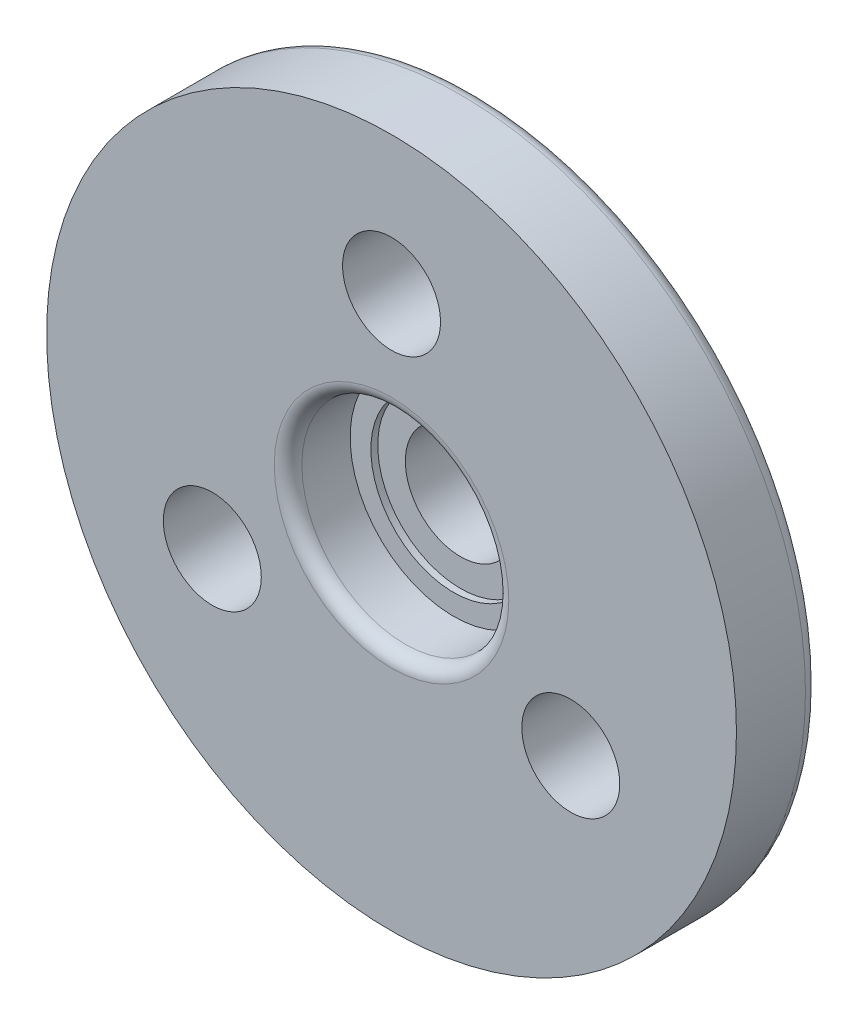
ISO-10303-21;
HEADER;
FILE_DESCRIPTION(('STEP AP214'),'2;1');
FILE_NAME('part.step','',(''),(''),'','','');
FILE_SCHEMA(('AUTOMOTIVE_DESIGN { 1 0 10303 214 1 1 1 1 }'));
ENDSEC;
DATA;
#1=APPLICATION_CONTEXT('core data for automotive mechanical design processes');
#2=APPLICATION_PROTOCOL_DEFINITION('international standard','automotive_design',2000,#1);
#3=PRODUCT_CONTEXT('',#1,'mechanical');
#4=PRODUCT('Part','Part','',(#3));
#5=PRODUCT_RELATED_PRODUCT_CATEGORY('part','',(#4));
#6=PRODUCT_DEFINITION_FORMATION('','',#4);
#7=PRODUCT_DEFINITION_CONTEXT('part definition',#1,'design');
#8=PRODUCT_DEFINITION('design','',#6,#7);
#9=PRODUCT_DEFINITION_SHAPE('','',#8);
#10=(LENGTH_UNIT() NAMED_UNIT(*) SI_UNIT(.MILLI.,.METRE.));
#11=(NAMED_UNIT(*) PLANE_ANGLE_UNIT() SI_UNIT($,.RADIAN.));
#12=(NAMED_UNIT(*) SI_UNIT($,.STERADIAN.) SOLID_ANGLE_UNIT());
#13=UNCERTAINTY_MEASURE_WITH_UNIT(LENGTH_MEASURE(1.E-05),#10,'distance_accuracy_value','');
#14=(GEOMETRIC_REPRESENTATION_CONTEXT(3) GLOBAL_UNCERTAINTY_ASSIGNED_CONTEXT((#13)) GLOBAL_UNIT_ASSIGNED_CONTEXT((#10,
#11,#12)) REPRESENTATION_CONTEXT('',''));
#15=CARTESIAN_POINT('',(0.,0.,0.));
#16=DIRECTION('',(0.,0.,1.));
#17=DIRECTION('',(1.,0.,0.));
#18=AXIS2_PLACEMENT_3D('',#15,#16,#17);
#19=CARTESIAN_POINT('',(0.,7.,-9.5));
#20=DIRECTION('',(0.,0.,1.));
#21=DIRECTION('',(1.,0.,0.));
#22=AXIS2_PLACEMENT_3D('',#19,#20,#21);
#23=PLANE('',#22);
#24=CARTESIAN_POINT('',(0.,0.,-9.5));
#25=DIRECTION('',(0.,0.,1.));
#26=DIRECTION('',(1.,0.,0.));
#27=AXIS2_PLACEMENT_3D('',#24,#25,#26);
#28=CIRCLE('',#27,7.);
#29=CARTESIAN_POINT('',(7.,0.,-9.5));
#30=VERTEX_POINT('',#29);
#31=EDGE_CURVE('E78',#30,#30,#28,.T.);
#32=ORIENTED_EDGE('',*,*,#31,.F.);
#33=EDGE_LOOP('',(#32));
#34=FACE_BOUND('',#33,.T.);
#35=CARTESIAN_POINT('',(0.,0.,-9.5));
#36=DIRECTION('',(0.,0.,1.));
#37=DIRECTION('',(1.,0.,0.));
#38=AXIS2_PLACEMENT_3D('',#35,#36,#37);
#39=CIRCLE('',#38,5.);
#40=CARTESIAN_POINT('',(5.,0.,-9.5));
#41=VERTEX_POINT('',#40);
#42=EDGE_CURVE('E65',#41,#41,#39,.T.);
#43=ORIENTED_EDGE('',*,*,#42,.T.);
#44=EDGE_LOOP('',(#43));
#45=FACE_BOUND('',#44,.T.);
#46=ADVANCED_FACE('F41',(#34,#45),#23,.F.);
#47=CARTESIAN_POINT('',(0.,0.,0.));
#48=DIRECTION('',(0.,0.,1.));
#49=DIRECTION('',(1.,0.,0.));
#50=AXIS2_PLACEMENT_3D('',#47,#48,#49);
#51=CYLINDRICAL_SURFACE('',#50,5.);
#52=CARTESIAN_POINT('',(0.,0.,-17.5));
#53=DIRECTION('',(0.,0.,1.));
#54=DIRECTION('',(1.,0.,0.));
#55=AXIS2_PLACEMENT_3D('',#52,#53,#54);
#56=CIRCLE('',#55,5.);
#57=CARTESIAN_POINT('',(5.,0.,-17.5));
#58=VERTEX_POINT('',#57);
#59=EDGE_CURVE('E61',#58,#58,#56,.T.);
#60=ORIENTED_EDGE('',*,*,#59,.T.);
#61=EDGE_LOOP('',(#60));
#62=FACE_BOUND('',#61,.T.);
#63=ORIENTED_EDGE('',*,*,#42,.F.);
#64=EDGE_LOOP('',(#63));
#65=FACE_BOUND('',#64,.T.);
#66=ADVANCED_FACE('F138',(#62,#65),#51,.T.);
#67=CARTESIAN_POINT('',(0.,0.,0.));
#68=DIRECTION('',(0.,0.,1.));
#69=DIRECTION('',(1.,0.,0.));
#70=AXIS2_PLACEMENT_3D('',#67,#68,#69);
#71=CYLINDRICAL_SURFACE('',#70,4.);
#72=CARTESIAN_POINT('',(0.,0.,-18.5));
#73=DIRECTION('',(0.,0.,1.));
#74=DIRECTION('',(1.,0.,0.));
#75=AXIS2_PLACEMENT_3D('',#72,#73,#74);
#76=CIRCLE('',#75,4.);
#77=CARTESIAN_POINT('',(4.,0.,-18.5));
#78=VERTEX_POINT('',#77);
#79=EDGE_CURVE('E81',#78,#78,#76,.T.);
#80=ORIENTED_EDGE('',*,*,#79,.F.);
#81=EDGE_LOOP('',(#80));
#82=FACE_BOUND('',#81,.T.);
#83=CARTESIAN_POINT('',(0.,0.,-7.5));
#84=DIRECTION('',(0.,0.,1.));
#85=DIRECTION('',(1.,0.,0.));
#86=AXIS2_PLACEMENT_3D('',#83,#84,#85);
#87=CIRCLE('',#86,4.);
#88=CARTESIAN_POINT('',(4.,0.,-7.5));
#89=VERTEX_POINT('',#88);
#90=EDGE_CURVE('E85',#89,#89,#87,.T.);
#91=ORIENTED_EDGE('',*,*,#90,.T.);
#92=EDGE_LOOP('',(#91));
#93=FACE_BOUND('',#92,.T.);
#94=ADVANCED_FACE('F145',(#82,#93),#71,.F.);
#95=CARTESIAN_POINT('',(0.,4.,-7.5));
#96=DIRECTION('',(0.,0.,-1.));
#97=DIRECTION('',(-1.,0.,0.));
#98=AXIS2_PLACEMENT_3D('',#95,#96,#97);
#99=PLANE('',#98);
#100=ORIENTED_EDGE('',*,*,#90,.F.);
#101=EDGE_LOOP('',(#100));
#102=FACE_BOUND('',#101,.T.);
#103=CARTESIAN_POINT('',(0.,0.,-7.5));
#104=DIRECTION('',(0.,0.,1.));
#105=DIRECTION('',(1.,0.,0.));
#106=AXIS2_PLACEMENT_3D('',#103,#104,#105);
#107=CIRCLE('',#106,6.);
#108=CARTESIAN_POINT('',(6.,0.,-7.5));
#109=VERTEX_POINT('',#108);
#110=EDGE_CURVE('E88',#109,#109,#107,.T.);
#111=ORIENTED_EDGE('',*,*,#110,.T.);
#112=EDGE_LOOP('',(#111));
#113=FACE_BOUND('',#112,.T.);
#114=ADVANCED_FACE('F273',(#102,#113),#99,.F.);
#115=CARTESIAN_POINT('',(0.,0.,0.));
#116=DIRECTION('',(0.,0.,1.));
#117=DIRECTION('',(1.,0.,0.));
#118=AXIS2_PLACEMENT_3D('',#115,#116,#117);
#119=CYLINDRICAL_SURFACE('',#118,6.);
#120=ORIENTED_EDGE('',*,*,#110,.F.);
#121=EDGE_LOOP('',(#120));
#122=FACE_BOUND('',#121,.T.);
#123=CARTESIAN_POINT('',(0.,0.,-7.));
#124=DIRECTION('',(0.,0.,1.));
#125=DIRECTION('',(1.,0.,0.));
#126=AXIS2_PLACEMENT_3D('',#123,#124,#125);
#127=CIRCLE('',#126,6.);
#128=CARTESIAN_POINT('',(6.,0.,-7.));
#129=VERTEX_POINT('',#128);
#130=EDGE_CURVE('E91',#129,#129,#127,.T.);
#131=ORIENTED_EDGE('',*,*,#130,.T.);
#132=EDGE_LOOP('',(#131));
#133=FACE_BOUND('',#132,.T.);
#134=ADVANCED_FACE('F264',(#122,#133),#119,.F.);
#135=CARTESIAN_POINT('',(0.,7.5,-7.));
#136=DIRECTION('',(0.,0.,-1.));
#137=DIRECTION('',(-1.,0.,0.));
#138=AXIS2_PLACEMENT_3D('',#135,#136,#137);
#139=PLANE('',#138);
#140=ORIENTED_EDGE('',*,*,#130,.F.);
#141=EDGE_LOOP('',(#140));
#142=FACE_BOUND('',#141,.T.);
#143=CARTESIAN_POINT('',(0.,0.,-7.));
#144=DIRECTION('',(0.,0.,1.));
#145=DIRECTION('',(1.,0.,0.));
#146=AXIS2_PLACEMENT_3D('',#143,#144,#145);
#147=CIRCLE('',#146,7.5);
#148=CARTESIAN_POINT('',(7.5,0.,-7.));
#149=VERTEX_POINT('',#148);
#150=EDGE_CURVE('E94',#149,#149,#147,.T.);
#151=ORIENTED_EDGE('',*,*,#150,.T.);
#152=EDGE_LOOP('',(#151));
#153=FACE_BOUND('',#152,.T.);
#154=ADVANCED_FACE('F208',(#142,#153),#139,.F.);
#155=CARTESIAN_POINT('',(0.,0.,0.));
#156=DIRECTION('',(0.,0.,1.));
#157=DIRECTION('',(1.,0.,0.));
#158=AXIS2_PLACEMENT_3D('',#155,#156,#157);
#159=CYLINDRICAL_SURFACE('',#158,7.5);
#160=CARTESIAN_POINT('',(0.,0.,-3.5));
#161=DIRECTION('',(0.,0.,-1.));
#162=DIRECTION('',(-1.,0.,0.));
#163=AXIS2_PLACEMENT_3D('',#160,#161,#162);
#164=CIRCLE('',#163,7.5);
#165=CARTESIAN_POINT('',(-7.5,0.,-3.5));
#166=VERTEX_POINT('',#165);
#167=EDGE_CURVE('E48',#166,#166,#164,.F.);
#168=ORIENTED_EDGE('',*,*,#167,.T.);
#169=EDGE_LOOP('',(#168));
#170=FACE_BOUND('',#169,.T.);
#171=ORIENTED_EDGE('',*,*,#150,.F.);
#172=EDGE_LOOP('',(#171));
#173=FACE_BOUND('',#172,.T.);
#174=ADVANCED_FACE('F119',(#170,#173),#159,.F.);
#175=CARTESIAN_POINT('',(0.,7.5,-2.5));
#176=DIRECTION('',(0.,0.,-1.));
#177=DIRECTION('',(-1.,0.,0.));
#178=AXIS2_PLACEMENT_3D('',#175,#176,#177);
#179=PLANE('',#178);
#180=CARTESIAN_POINT('',(0.,0.,-2.5));
#181=DIRECTION('',(0.,0.,-1.));
#182=DIRECTION('',(-1.,0.,0.));
#183=AXIS2_PLACEMENT_3D('',#180,#181,#182);
#184=CIRCLE('',#183,8.5);
#185=CARTESIAN_POINT('',(-8.5,0.,-2.5));
#186=VERTEX_POINT('',#185);
#187=EDGE_CURVE('E10',#186,#186,#184,.T.);
#188=ORIENTED_EDGE('',*,*,#187,.T.);
#189=EDGE_LOOP('',(#188));
#190=FACE_BOUND('',#189,.T.);
#191=CARTESIAN_POINT('',(12.9903810567666,-7.49999999999988,-2.5));
#192=DIRECTION('',(0.,0.,1.));
#193=DIRECTION('',(1.,0.,0.));
#194=AXIS2_PLACEMENT_3D('',#191,#192,#193);
#195=CIRCLE('',#194,3.55);
#196=CARTESIAN_POINT('',(16.5403810567666,-7.49999999999988,-2.5));
#197=VERTEX_POINT('',#196);
#198=EDGE_CURVE('E70',#197,#197,#195,.T.);
#199=ORIENTED_EDGE('',*,*,#198,.F.);
#200=EDGE_LOOP('',(#199));
#201=FACE_BOUND('',#200,.T.);
#202=CARTESIAN_POINT('',(-12.9903810567665,-7.50000000000006,-2.5));
#203=DIRECTION('',(0.,0.,1.));
#204=DIRECTION('',(1.,0.,0.));
#205=AXIS2_PLACEMENT_3D('',#202,#203,#204);
#206=CIRCLE('',#205,3.55);
#207=CARTESIAN_POINT('',(-9.44038105676655,-7.50000000000006,-2.5));
#208=VERTEX_POINT('',#207);
#209=EDGE_CURVE('E69',#208,#208,#206,.T.);
#210=ORIENTED_EDGE('',*,*,#209,.F.);
#211=EDGE_LOOP('',(#210));
#212=FACE_BOUND('',#211,.T.);
#213=CARTESIAN_POINT('',(0.,15.,-2.5));
#214=DIRECTION('',(0.,0.,1.));
#215=DIRECTION('',(1.,0.,0.));
#216=AXIS2_PLACEMENT_3D('',#213,#214,#215);
#217=CIRCLE('',#216,3.55);
#218=CARTESIAN_POINT('',(3.55,15.,-2.5));
#219=VERTEX_POINT('',#218);
#220=EDGE_CURVE('E74',#219,#219,#217,.T.);
#221=ORIENTED_EDGE('',*,*,#220,.F.);
#222=EDGE_LOOP('',(#221));
#223=FACE_BOUND('',#222,.T.);
#224=CARTESIAN_POINT('',(0.,0.,-2.5));
#225=DIRECTION('',(0.,0.,1.));
#226=DIRECTION('',(1.,0.,0.));
#227=AXIS2_PLACEMENT_3D('',#224,#225,#226);
#228=CIRCLE('',#227,25.);
#229=CARTESIAN_POINT('',(25.,0.,-2.5));
#230=VERTEX_POINT('',#229);
#231=EDGE_CURVE('E97',#230,#230,#228,.T.);
#232=ORIENTED_EDGE('',*,*,#231,.T.);
#233=EDGE_LOOP('',(#232));
#234=FACE_BOUND('',#233,.T.);
#235=ADVANCED_FACE('F115',(#190,#201,#212,#223,#234),#179,.F.);
#236=CARTESIAN_POINT('',(0.,0.,0.));
#237=DIRECTION('',(0.,0.,1.));
#238=DIRECTION('',(1.,0.,0.));
#239=AXIS2_PLACEMENT_3D('',#236,#237,#238);
#240=CYLINDRICAL_SURFACE('',#239,25.);
#241=CARTESIAN_POINT('',(0.,0.,-7.5));
#242=DIRECTION('',(0.,0.,1.));
#243=DIRECTION('',(1.,0.,0.));
#244=AXIS2_PLACEMENT_3D('',#241,#242,#243);
#245=CIRCLE('',#244,25.);
#246=CARTESIAN_POINT('',(25.,0.,-7.5));
#247=VERTEX_POINT('',#246);
#248=EDGE_CURVE('E56',#247,#247,#245,.T.);
#249=ORIENTED_EDGE('',*,*,#248,.T.);
#250=EDGE_LOOP('',(#249));
#251=FACE_BOUND('',#250,.T.);
#252=ORIENTED_EDGE('',*,*,#231,.F.);
#253=EDGE_LOOP('',(#252));
#254=FACE_BOUND('',#253,.T.);
#255=ADVANCED_FACE('F118',(#251,#254),#240,.T.);
#256=CARTESIAN_POINT('',(0.,7.,-8.5));
#257=DIRECTION('',(0.,0.,1.));
#258=DIRECTION('',(1.,0.,0.));
#259=AXIS2_PLACEMENT_3D('',#256,#257,#258);
#260=PLANE('',#259);
#261=CARTESIAN_POINT('',(0.,0.,-8.5));
#262=DIRECTION('',(0.,0.,1.));
#263=DIRECTION('',(1.,0.,0.));
#264=AXIS2_PLACEMENT_3D('',#261,#262,#263);
#265=CIRCLE('',#264,24.);
#266=CARTESIAN_POINT('',(24.,0.,-8.5));
#267=VERTEX_POINT('',#266);
#268=EDGE_CURVE('E52',#267,#267,#265,.F.);
#269=ORIENTED_EDGE('',*,*,#268,.T.);
#270=EDGE_LOOP('',(#269));
#271=FACE_BOUND('',#270,.T.);
#272=CARTESIAN_POINT('',(12.9903810567666,-7.49999999999988,-8.5));
#273=DIRECTION('',(0.,0.,1.));
#274=DIRECTION('',(1.,0.,0.));
#275=AXIS2_PLACEMENT_3D('',#272,#273,#274);
#276=CIRCLE('',#275,3.55);
#277=CARTESIAN_POINT('',(16.5403810567666,-7.49999999999988,-8.5));
#278=VERTEX_POINT('',#277);
#279=EDGE_CURVE('E66',#278,#278,#276,.T.);
#280=ORIENTED_EDGE('',*,*,#279,.T.);
#281=EDGE_LOOP('',(#280));
#282=FACE_BOUND('',#281,.T.);
#283=CARTESIAN_POINT('',(-12.9903810567665,-7.50000000000006,-8.5));
#284=DIRECTION('',(0.,0.,1.));
#285=DIRECTION('',(1.,0.,0.));
#286=AXIS2_PLACEMENT_3D('',#283,#284,#285);
#287=CIRCLE('',#286,3.55);
#288=CARTESIAN_POINT('',(-9.44038105676655,-7.50000000000006,-8.5));
#289=VERTEX_POINT('',#288);
#290=EDGE_CURVE('E71',#289,#289,#287,.T.);
#291=ORIENTED_EDGE('',*,*,#290,.T.);
#292=EDGE_LOOP('',(#291));
#293=FACE_BOUND('',#292,.T.);
#294=CARTESIAN_POINT('',(0.,15.,-8.5));
#295=DIRECTION('',(0.,0.,1.));
#296=DIRECTION('',(1.,0.,0.));
#297=AXIS2_PLACEMENT_3D('',#294,#295,#296);
#298=CIRCLE('',#297,3.55);
#299=CARTESIAN_POINT('',(3.55,15.,-8.5));
#300=VERTEX_POINT('',#299);
#301=EDGE_CURVE('E75',#300,#300,#298,.T.);
#302=ORIENTED_EDGE('',*,*,#301,.T.);
#303=EDGE_LOOP('',(#302));
#304=FACE_BOUND('',#303,.T.);
#305=CARTESIAN_POINT('',(0.,0.,-8.5));
#306=DIRECTION('',(0.,0.,1.));
#307=DIRECTION('',(1.,0.,0.));
#308=AXIS2_PLACEMENT_3D('',#305,#306,#307);
#309=CIRCLE('',#308,7.);
#310=CARTESIAN_POINT('',(7.,0.,-8.5));
#311=VERTEX_POINT('',#310);
#312=EDGE_CURVE('E100',#311,#311,#309,.T.);
#313=ORIENTED_EDGE('',*,*,#312,.T.);
#314=EDGE_LOOP('',(#313));
#315=FACE_BOUND('',#314,.T.);
#316=ADVANCED_FACE('F128',(#271,#282,#293,#304,#315),#260,.F.);
#317=CARTESIAN_POINT('',(0.,0.,0.));
#318=DIRECTION('',(0.,0.,1.));
#319=DIRECTION('',(1.,0.,0.));
#320=AXIS2_PLACEMENT_3D('',#317,#318,#319);
#321=CYLINDRICAL_SURFACE('',#320,7.);
#322=ORIENTED_EDGE('',*,*,#312,.F.);
#323=EDGE_LOOP('',(#322));
#324=FACE_BOUND('',#323,.T.);
#325=ORIENTED_EDGE('',*,*,#31,.T.);
#326=EDGE_LOOP('',(#325));
#327=FACE_BOUND('',#326,.T.);
#328=ADVANCED_FACE('F134',(#324,#327),#321,.T.);
#329=CARTESIAN_POINT('',(0.,15.,-2.5));
#330=DIRECTION('',(0.,0.,1.));
#331=DIRECTION('',(1.,0.,0.));
#332=AXIS2_PLACEMENT_3D('',#329,#330,#331);
#333=CYLINDRICAL_SURFACE('',#332,3.55);
#334=ORIENTED_EDGE('',*,*,#220,.T.);
#335=EDGE_LOOP('',(#334));
#336=FACE_BOUND('',#335,.T.);
#337=ORIENTED_EDGE('',*,*,#301,.F.);
#338=EDGE_LOOP('',(#337));
#339=FACE_BOUND('',#338,.T.);
#340=ADVANCED_FACE('F176',(#336,#339),#333,.F.);
#341=CARTESIAN_POINT('',(-12.9903810567665,-7.50000000000006,-2.5));
#342=DIRECTION('',(0.,0.,1.));
#343=DIRECTION('',(1.,0.,0.));
#344=AXIS2_PLACEMENT_3D('',#341,#342,#343);
#345=CYLINDRICAL_SURFACE('',#344,3.55);
#346=ORIENTED_EDGE('',*,*,#209,.T.);
#347=EDGE_LOOP('',(#346));
#348=FACE_BOUND('',#347,.T.);
#349=ORIENTED_EDGE('',*,*,#290,.F.);
#350=EDGE_LOOP('',(#349));
#351=FACE_BOUND('',#350,.T.);
#352=ADVANCED_FACE('F182',(#348,#351),#345,.F.);
#353=CARTESIAN_POINT('',(12.9903810567666,-7.49999999999988,-2.5));
#354=DIRECTION('',(0.,0.,1.));
#355=DIRECTION('',(1.,0.,0.));
#356=AXIS2_PLACEMENT_3D('',#353,#354,#355);
#357=CYLINDRICAL_SURFACE('',#356,3.55);
#358=ORIENTED_EDGE('',*,*,#198,.T.);
#359=EDGE_LOOP('',(#358));
#360=FACE_BOUND('',#359,.T.);
#361=ORIENTED_EDGE('',*,*,#279,.F.);
#362=EDGE_LOOP('',(#361));
#363=FACE_BOUND('',#362,.T.);
#364=ADVANCED_FACE('F112',(#360,#363),#357,.F.);
#365=CARTESIAN_POINT('',(0.,0.,-17.5));
#366=DIRECTION('',(0.,0.,1.));
#367=DIRECTION('',(1.,0.,0.));
#368=AXIS2_PLACEMENT_3D('',#365,#366,#367);
#369=TOROIDAL_SURFACE('',#368,4.,1.);
#370=ORIENTED_EDGE('',*,*,#79,.T.);
#371=EDGE_LOOP('',(#370));
#372=FACE_BOUND('',#371,.T.);
#373=ORIENTED_EDGE('',*,*,#59,.F.);
#374=EDGE_LOOP('',(#373));
#375=FACE_BOUND('',#374,.T.);
#376=ADVANCED_FACE('F152',(#372,#375),#369,.T.);
#377=CARTESIAN_POINT('',(0.,0.,-7.5));
#378=DIRECTION('',(0.,0.,1.));
#379=DIRECTION('',(1.,0.,0.));
#380=AXIS2_PLACEMENT_3D('',#377,#378,#379);
#381=TOROIDAL_SURFACE('',#380,24.,1.);
#382=ORIENTED_EDGE('',*,*,#268,.F.);
#383=EDGE_LOOP('',(#382));
#384=FACE_BOUND('',#383,.T.);
#385=ORIENTED_EDGE('',*,*,#248,.F.);
#386=EDGE_LOOP('',(#385));
#387=FACE_BOUND('',#386,.T.);
#388=ADVANCED_FACE('F154',(#384,#387),#381,.T.);
#389=CARTESIAN_POINT('',(0.,0.,-3.5));
#390=DIRECTION('',(0.,0.,-1.));
#391=DIRECTION('',(-1.,0.,0.));
#392=AXIS2_PLACEMENT_3D('',#389,#390,#391);
#393=TOROIDAL_SURFACE('',#392,8.5,1.);
#394=ORIENTED_EDGE('',*,*,#187,.F.);
#395=EDGE_LOOP('',(#394));
#396=FACE_BOUND('',#395,.T.);
#397=ORIENTED_EDGE('',*,*,#167,.F.);
#398=EDGE_LOOP('',(#397));
#399=FACE_BOUND('',#398,.T.);
#400=ADVANCED_FACE('F43',(#396,#399),#393,.T.);
#401=CLOSED_SHELL('',(#46,#66,#94,#114,#134,#154,#174,#235,#255,#316,#328,#340,#352,#364,#376,
#388,#400));
#402=MANIFOLD_SOLID_BREP('B2',#401);
#403=ADVANCED_BREP_SHAPE_REPRESENTATION('',(#18,#402),#14);
#404=SHAPE_DEFINITION_REPRESENTATION(#9,#403);
ENDSEC;
END-ISO-10303-21;
